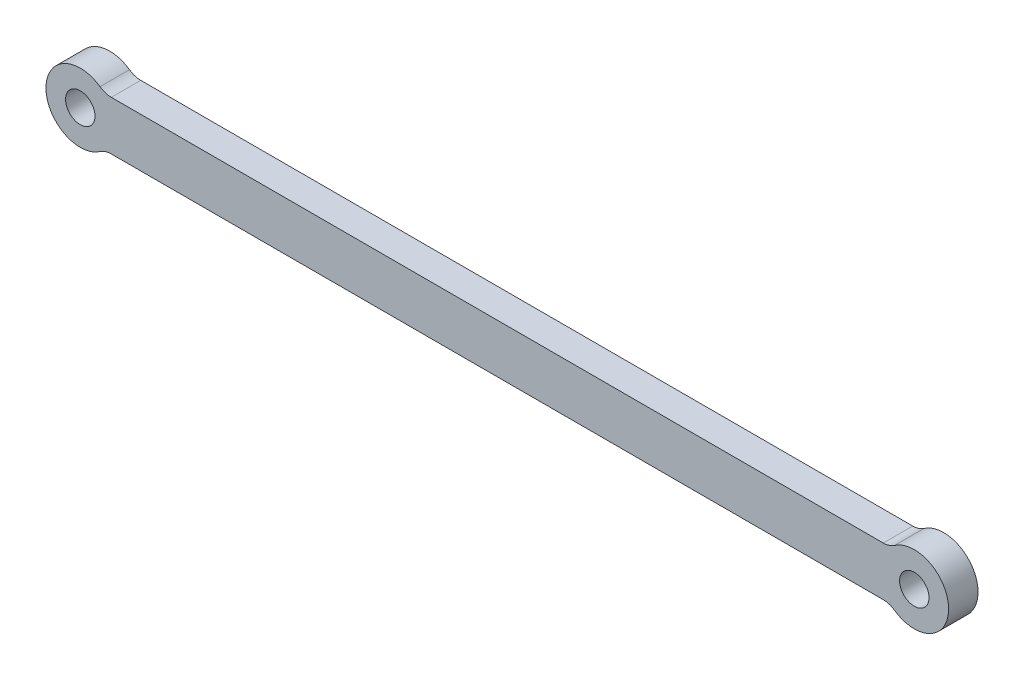
ISO-10303-21;
HEADER;
FILE_DESCRIPTION(('STEP AP214'),'2;1');
FILE_NAME('part.step','',(''),(''),'','','');
FILE_SCHEMA(('AUTOMOTIVE_DESIGN { 1 0 10303 214 1 1 1 1 }'));
ENDSEC;
DATA;
#1=APPLICATION_CONTEXT('core data for automotive mechanical design processes');
#2=APPLICATION_PROTOCOL_DEFINITION('international standard','automotive_design',2000,#1);
#3=PRODUCT_CONTEXT('',#1,'mechanical');
#4=PRODUCT('Part','Part','',(#3));
#5=PRODUCT_RELATED_PRODUCT_CATEGORY('part','',(#4));
#6=PRODUCT_DEFINITION_FORMATION('','',#4);
#7=PRODUCT_DEFINITION_CONTEXT('part definition',#1,'design');
#8=PRODUCT_DEFINITION('design','',#6,#7);
#9=PRODUCT_DEFINITION_SHAPE('','',#8);
#10=(LENGTH_UNIT() NAMED_UNIT(*) SI_UNIT(.MILLI.,.METRE.));
#11=(NAMED_UNIT(*) PLANE_ANGLE_UNIT() SI_UNIT($,.RADIAN.));
#12=(NAMED_UNIT(*) SI_UNIT($,.STERADIAN.) SOLID_ANGLE_UNIT());
#13=UNCERTAINTY_MEASURE_WITH_UNIT(LENGTH_MEASURE(1.E-05),#10,'distance_accuracy_value','');
#14=(GEOMETRIC_REPRESENTATION_CONTEXT(3) GLOBAL_UNCERTAINTY_ASSIGNED_CONTEXT((#13)) GLOBAL_UNIT_ASSIGNED_CONTEXT((#10,
#11,#12)) REPRESENTATION_CONTEXT('',''));
#15=CARTESIAN_POINT('',(0.,0.,0.));
#16=DIRECTION('',(0.,0.,1.));
#17=DIRECTION('',(1.,0.,0.));
#18=AXIS2_PLACEMENT_3D('',#15,#16,#17);
#19=CARTESIAN_POINT('',(0.,0.,3.));
#20=DIRECTION('',(0.,0.,1.));
#21=DIRECTION('',(1.,0.,0.));
#22=AXIS2_PLACEMENT_3D('',#19,#20,#21);
#23=PLANE('',#22);
#24=CARTESIAN_POINT('',(81.8377223398316,-4.49999999999999,3.));
#25=DIRECTION('',(0.,0.,1.));
#26=DIRECTION('',(-1.,0.,0.));
#27=AXIS2_PLACEMENT_3D('',#24,#25,#26);
#28=CIRCLE('',#27,2.);
#29=CARTESIAN_POINT('',(82.9876414889837,-2.86363636363635,3.));
#30=VERTEX_POINT('',#29);
#31=CARTESIAN_POINT('',(81.8377223398316,-2.49999999999999,3.));
#32=VERTEX_POINT('',#31);
#33=EDGE_CURVE('E104',#30,#32,#28,.T.);
#34=ORIENTED_EDGE('',*,*,#33,.F.);
#35=CARTESIAN_POINT('',(85.,0.,3.));
#36=DIRECTION('',(0.,0.,1.));
#37=DIRECTION('',(1.,0.,0.));
#38=AXIS2_PLACEMENT_3D('',#35,#36,#37);
#39=CIRCLE('',#38,3.5);
#40=CARTESIAN_POINT('',(82.9876414889837,2.86363636363636,3.));
#41=VERTEX_POINT('',#40);
#42=EDGE_CURVE('E11',#30,#41,#39,.T.);
#43=ORIENTED_EDGE('',*,*,#42,.T.);
#44=CARTESIAN_POINT('',(81.8377223398316,4.49999999999999,3.));
#45=DIRECTION('',(0.,0.,1.));
#46=DIRECTION('',(1.,0.,0.));
#47=AXIS2_PLACEMENT_3D('',#44,#45,#46);
#48=CIRCLE('',#47,1.99999999999998);
#49=CARTESIAN_POINT('',(81.8377223398316,2.50000000000001,3.));
#50=VERTEX_POINT('',#49);
#51=EDGE_CURVE('E101',#50,#41,#48,.T.);
#52=ORIENTED_EDGE('',*,*,#51,.F.);
#53=DIRECTION('',(1.,0.,0.));
#54=VECTOR('',#53,1.);
#55=CARTESIAN_POINT('',(3.1622776601684,2.5,3.));
#56=LINE('',#55,#54);
#57=CARTESIAN_POINT('',(3.1622776601684,2.5,3.));
#58=VERTEX_POINT('',#57);
#59=EDGE_CURVE('E113',#58,#50,#56,.T.);
#60=ORIENTED_EDGE('',*,*,#59,.F.);
#61=CARTESIAN_POINT('',(3.1622776601684,4.49999999999998,3.));
#62=DIRECTION('',(0.,0.,1.));
#63=DIRECTION('',(-1.,0.,0.));
#64=AXIS2_PLACEMENT_3D('',#61,#62,#63);
#65=CIRCLE('',#64,1.99999999999998);
#66=CARTESIAN_POINT('',(2.01235851101626,2.86363636363637,3.));
#67=VERTEX_POINT('',#66);
#68=EDGE_CURVE('E118',#67,#58,#65,.T.);
#69=ORIENTED_EDGE('',*,*,#68,.F.);
#70=CARTESIAN_POINT('',(0.,0.,3.));
#71=DIRECTION('',(0.,0.,1.));
#72=DIRECTION('',(1.,0.,0.));
#73=AXIS2_PLACEMENT_3D('',#70,#71,#72);
#74=CIRCLE('',#73,3.5);
#75=CARTESIAN_POINT('',(2.01235851101626,-2.86363636363637,3.));
#76=VERTEX_POINT('',#75);
#77=EDGE_CURVE('E44',#67,#76,#74,.T.);
#78=ORIENTED_EDGE('',*,*,#77,.T.);
#79=CARTESIAN_POINT('',(3.1622776601684,-4.5,3.));
#80=DIRECTION('',(0.,0.,1.));
#81=DIRECTION('',(1.,0.,0.));
#82=AXIS2_PLACEMENT_3D('',#79,#80,#81);
#83=CIRCLE('',#82,2.);
#84=CARTESIAN_POINT('',(3.1622776601684,-2.5,3.));
#85=VERTEX_POINT('',#84);
#86=EDGE_CURVE('E157',#85,#76,#83,.T.);
#87=ORIENTED_EDGE('',*,*,#86,.F.);
#88=DIRECTION('',(-1.,0.,0.));
#89=VECTOR('',#88,1.);
#90=CARTESIAN_POINT('',(3.1622776601684,-2.5,3.));
#91=LINE('',#90,#89);
#92=EDGE_CURVE('E172',#32,#85,#91,.T.);
#93=ORIENTED_EDGE('',*,*,#92,.F.);
#94=EDGE_LOOP('',(#34,#43,#52,#60,#69,#78,#87,#93));
#95=FACE_BOUND('',#94,.T.);
#96=CARTESIAN_POINT('',(0.,0.,3.));
#97=DIRECTION('',(0.,0.,1.));
#98=DIRECTION('',(1.,0.,0.));
#99=AXIS2_PLACEMENT_3D('',#96,#97,#98);
#100=CIRCLE('',#99,1.5);
#101=CARTESIAN_POINT('',(1.5,0.,3.));
#102=VERTEX_POINT('',#101);
#103=EDGE_CURVE('E137',#102,#102,#100,.T.);
#104=ORIENTED_EDGE('',*,*,#103,.F.);
#105=EDGE_LOOP('',(#104));
#106=FACE_BOUND('',#105,.T.);
#107=CARTESIAN_POINT('',(85.,0.,3.));
#108=DIRECTION('',(0.,0.,1.));
#109=DIRECTION('',(1.,0.,0.));
#110=AXIS2_PLACEMENT_3D('',#107,#108,#109);
#111=CIRCLE('',#110,1.5);
#112=CARTESIAN_POINT('',(86.5,0.,3.));
#113=VERTEX_POINT('',#112);
#114=EDGE_CURVE('E129',#113,#113,#111,.T.);
#115=ORIENTED_EDGE('',*,*,#114,.F.);
#116=EDGE_LOOP('',(#115));
#117=FACE_BOUND('',#116,.T.);
#118=ADVANCED_FACE('F34',(#95,#106,#117),#23,.T.);
#119=CARTESIAN_POINT('',(0.,0.,0.));
#120=DIRECTION('',(0.,0.,1.));
#121=DIRECTION('',(1.,0.,0.));
#122=AXIS2_PLACEMENT_3D('',#119,#120,#121);
#123=PLANE('',#122);
#124=CARTESIAN_POINT('',(85.,0.,0.));
#125=DIRECTION('',(0.,0.,1.));
#126=DIRECTION('',(1.,0.,0.));
#127=AXIS2_PLACEMENT_3D('',#124,#125,#126);
#128=CIRCLE('',#127,3.5);
#129=CARTESIAN_POINT('',(82.9876414889837,-2.86363636363635,0.));
#130=VERTEX_POINT('',#129);
#131=CARTESIAN_POINT('',(82.9876414889837,2.86363636363636,0.));
#132=VERTEX_POINT('',#131);
#133=EDGE_CURVE('E38',#130,#132,#128,.T.);
#134=ORIENTED_EDGE('',*,*,#133,.F.);
#135=CARTESIAN_POINT('',(81.8377223398316,-4.49999999999999,0.));
#136=DIRECTION('',(0.,0.,1.));
#137=DIRECTION('',(-1.,0.,0.));
#138=AXIS2_PLACEMENT_3D('',#135,#136,#137);
#139=CIRCLE('',#138,2.);
#140=CARTESIAN_POINT('',(81.8377223398316,-2.49999999999999,0.));
#141=VERTEX_POINT('',#140);
#142=EDGE_CURVE('E167',#130,#141,#139,.T.);
#143=ORIENTED_EDGE('',*,*,#142,.T.);
#144=DIRECTION('',(-1.,0.,0.));
#145=VECTOR('',#144,1.);
#146=CARTESIAN_POINT('',(3.1622776601684,-2.5,0.));
#147=LINE('',#146,#145);
#148=CARTESIAN_POINT('',(3.1622776601684,-2.5,0.));
#149=VERTEX_POINT('',#148);
#150=EDGE_CURVE('E163',#141,#149,#147,.T.);
#151=ORIENTED_EDGE('',*,*,#150,.T.);
#152=CARTESIAN_POINT('',(3.1622776601684,-4.5,0.));
#153=DIRECTION('',(0.,0.,1.));
#154=DIRECTION('',(1.,0.,0.));
#155=AXIS2_PLACEMENT_3D('',#152,#153,#154);
#156=CIRCLE('',#155,2.);
#157=CARTESIAN_POINT('',(2.01235851101626,-2.86363636363637,0.));
#158=VERTEX_POINT('',#157);
#159=EDGE_CURVE('E154',#149,#158,#156,.T.);
#160=ORIENTED_EDGE('',*,*,#159,.T.);
#161=CARTESIAN_POINT('',(0.,0.,0.));
#162=DIRECTION('',(0.,0.,1.));
#163=DIRECTION('',(1.,0.,0.));
#164=AXIS2_PLACEMENT_3D('',#161,#162,#163);
#165=CIRCLE('',#164,3.5);
#166=CARTESIAN_POINT('',(2.01235851101626,2.86363636363637,0.));
#167=VERTEX_POINT('',#166);
#168=EDGE_CURVE('E140',#167,#158,#165,.T.);
#169=ORIENTED_EDGE('',*,*,#168,.F.);
#170=CARTESIAN_POINT('',(3.1622776601684,4.49999999999998,0.));
#171=DIRECTION('',(0.,0.,1.));
#172=DIRECTION('',(-1.,0.,0.));
#173=AXIS2_PLACEMENT_3D('',#170,#171,#172);
#174=CIRCLE('',#173,1.99999999999998);
#175=CARTESIAN_POINT('',(3.1622776601684,2.5,0.));
#176=VERTEX_POINT('',#175);
#177=EDGE_CURVE('E112',#167,#176,#174,.T.);
#178=ORIENTED_EDGE('',*,*,#177,.T.);
#179=DIRECTION('',(1.,0.,0.));
#180=VECTOR('',#179,1.);
#181=CARTESIAN_POINT('',(3.1622776601684,2.5,0.));
#182=LINE('',#181,#180);
#183=CARTESIAN_POINT('',(81.8377223398316,2.50000000000001,0.));
#184=VERTEX_POINT('',#183);
#185=EDGE_CURVE('E116',#176,#184,#182,.T.);
#186=ORIENTED_EDGE('',*,*,#185,.T.);
#187=CARTESIAN_POINT('',(81.8377223398316,4.49999999999999,0.));
#188=DIRECTION('',(0.,0.,1.));
#189=DIRECTION('',(1.,0.,0.));
#190=AXIS2_PLACEMENT_3D('',#187,#188,#189);
#191=CIRCLE('',#190,1.99999999999998);
#192=EDGE_CURVE('E128',#184,#132,#191,.T.);
#193=ORIENTED_EDGE('',*,*,#192,.T.);
#194=EDGE_LOOP('',(#134,#143,#151,#160,#169,#178,#186,#193));
#195=FACE_BOUND('',#194,.T.);
#196=CARTESIAN_POINT('',(0.,0.,0.));
#197=DIRECTION('',(0.,0.,1.));
#198=DIRECTION('',(1.,0.,0.));
#199=AXIS2_PLACEMENT_3D('',#196,#197,#198);
#200=CIRCLE('',#199,1.5);
#201=CARTESIAN_POINT('',(1.5,0.,0.));
#202=VERTEX_POINT('',#201);
#203=EDGE_CURVE('E132',#202,#202,#200,.T.);
#204=ORIENTED_EDGE('',*,*,#203,.T.);
#205=EDGE_LOOP('',(#204));
#206=FACE_BOUND('',#205,.T.);
#207=CARTESIAN_POINT('',(85.,0.,0.));
#208=DIRECTION('',(0.,0.,1.));
#209=DIRECTION('',(1.,0.,0.));
#210=AXIS2_PLACEMENT_3D('',#207,#208,#209);
#211=CIRCLE('',#210,1.5);
#212=CARTESIAN_POINT('',(86.5,0.,0.));
#213=VERTEX_POINT('',#212);
#214=EDGE_CURVE('E133',#213,#213,#211,.T.);
#215=ORIENTED_EDGE('',*,*,#214,.T.);
#216=EDGE_LOOP('',(#215));
#217=FACE_BOUND('',#216,.T.);
#218=ADVANCED_FACE('F160',(#195,#206,#217),#123,.F.);
#219=CARTESIAN_POINT('',(0.,0.,3.));
#220=DIRECTION('',(0.,0.,-1.));
#221=DIRECTION('',(-1.,0.,0.));
#222=AXIS2_PLACEMENT_3D('',#219,#220,#221);
#223=CYLINDRICAL_SURFACE('',#222,3.5);
#224=ORIENTED_EDGE('',*,*,#168,.T.);
#225=DIRECTION('',(0.,0.,1.));
#226=VECTOR('',#225,1.);
#227=CARTESIAN_POINT('',(2.01235851101626,-2.86363636363637,0.));
#228=LINE('',#227,#226);
#229=EDGE_CURVE('E147',#158,#76,#228,.T.);
#230=ORIENTED_EDGE('',*,*,#229,.T.);
#231=ORIENTED_EDGE('',*,*,#77,.F.);
#232=DIRECTION('',(0.,0.,1.));
#233=VECTOR('',#232,1.);
#234=CARTESIAN_POINT('',(2.01235851101626,2.86363636363637,0.));
#235=LINE('',#234,#233);
#236=EDGE_CURVE('E125',#167,#67,#235,.T.);
#237=ORIENTED_EDGE('',*,*,#236,.F.);
#238=EDGE_LOOP('',(#224,#230,#231,#237));
#239=FACE_BOUND('',#238,.T.);
#240=ADVANCED_FACE('F36',(#239),#223,.T.);
#241=CARTESIAN_POINT('',(85.,0.,3.));
#242=DIRECTION('',(0.,0.,-1.));
#243=DIRECTION('',(-1.,0.,0.));
#244=AXIS2_PLACEMENT_3D('',#241,#242,#243);
#245=CYLINDRICAL_SURFACE('',#244,3.5);
#246=ORIENTED_EDGE('',*,*,#133,.T.);
#247=DIRECTION('',(0.,0.,1.));
#248=VECTOR('',#247,1.);
#249=CARTESIAN_POINT('',(82.9876414889837,2.86363636363636,0.));
#250=LINE('',#249,#248);
#251=EDGE_CURVE('E108',#132,#41,#250,.T.);
#252=ORIENTED_EDGE('',*,*,#251,.T.);
#253=ORIENTED_EDGE('',*,*,#42,.F.);
#254=DIRECTION('',(0.,0.,1.));
#255=VECTOR('',#254,1.);
#256=CARTESIAN_POINT('',(82.9876414889837,-2.86363636363635,0.));
#257=LINE('',#256,#255);
#258=EDGE_CURVE('E136',#130,#30,#257,.T.);
#259=ORIENTED_EDGE('',*,*,#258,.F.);
#260=EDGE_LOOP('',(#246,#252,#253,#259));
#261=FACE_BOUND('',#260,.T.);
#262=ADVANCED_FACE('F109',(#261),#245,.T.);
#263=CARTESIAN_POINT('',(0.,0.,3.));
#264=DIRECTION('',(0.,0.,-1.));
#265=DIRECTION('',(-1.,0.,0.));
#266=AXIS2_PLACEMENT_3D('',#263,#264,#265);
#267=CYLINDRICAL_SURFACE('',#266,1.5);
#268=ORIENTED_EDGE('',*,*,#103,.T.);
#269=EDGE_LOOP('',(#268));
#270=FACE_BOUND('',#269,.T.);
#271=ORIENTED_EDGE('',*,*,#203,.F.);
#272=EDGE_LOOP('',(#271));
#273=FACE_BOUND('',#272,.T.);
#274=ADVANCED_FACE('F204',(#270,#273),#267,.F.);
#275=CARTESIAN_POINT('',(85.,0.,3.));
#276=DIRECTION('',(0.,0.,-1.));
#277=DIRECTION('',(-1.,0.,0.));
#278=AXIS2_PLACEMENT_3D('',#275,#276,#277);
#279=CYLINDRICAL_SURFACE('',#278,1.5);
#280=ORIENTED_EDGE('',*,*,#114,.T.);
#281=EDGE_LOOP('',(#280));
#282=FACE_BOUND('',#281,.T.);
#283=ORIENTED_EDGE('',*,*,#214,.F.);
#284=EDGE_LOOP('',(#283));
#285=FACE_BOUND('',#284,.T.);
#286=ADVANCED_FACE('F195',(#282,#285),#279,.F.);
#287=CARTESIAN_POINT('',(81.8377223398316,4.49999999999999,0.));
#288=DIRECTION('',(0.,0.,1.));
#289=DIRECTION('',(1.,0.,0.));
#290=AXIS2_PLACEMENT_3D('',#287,#288,#289);
#291=CYLINDRICAL_SURFACE('',#290,1.99999999999998);
#292=ORIENTED_EDGE('',*,*,#51,.T.);
#293=ORIENTED_EDGE('',*,*,#251,.F.);
#294=ORIENTED_EDGE('',*,*,#192,.F.);
#295=DIRECTION('',(0.,0.,1.));
#296=VECTOR('',#295,1.);
#297=CARTESIAN_POINT('',(81.8377223398316,2.50000000000001,0.));
#298=LINE('',#297,#296);
#299=EDGE_CURVE('E93',#184,#50,#298,.T.);
#300=ORIENTED_EDGE('',*,*,#299,.T.);
#301=EDGE_LOOP('',(#292,#293,#294,#300));
#302=FACE_BOUND('',#301,.T.);
#303=ADVANCED_FACE('F111',(#302),#291,.F.);
#304=CARTESIAN_POINT('',(3.1622776601684,2.5,0.));
#305=DIRECTION('',(0.,-1.,0.));
#306=DIRECTION('',(1.,0.,0.));
#307=AXIS2_PLACEMENT_3D('',#304,#305,#306);
#308=PLANE('',#307);
#309=ORIENTED_EDGE('',*,*,#59,.T.);
#310=ORIENTED_EDGE('',*,*,#299,.F.);
#311=ORIENTED_EDGE('',*,*,#185,.F.);
#312=DIRECTION('',(0.,0.,1.));
#313=VECTOR('',#312,1.);
#314=CARTESIAN_POINT('',(3.1622776601684,2.5,0.));
#315=LINE('',#314,#313);
#316=EDGE_CURVE('E123',#176,#58,#315,.T.);
#317=ORIENTED_EDGE('',*,*,#316,.T.);
#318=EDGE_LOOP('',(#309,#310,#311,#317));
#319=FACE_BOUND('',#318,.T.);
#320=ADVANCED_FACE('F186',(#319),#308,.F.);
#321=CARTESIAN_POINT('',(3.1622776601684,4.49999999999998,0.));
#322=DIRECTION('',(0.,0.,1.));
#323=DIRECTION('',(1.,0.,0.));
#324=AXIS2_PLACEMENT_3D('',#321,#322,#323);
#325=CYLINDRICAL_SURFACE('',#324,1.99999999999998);
#326=ORIENTED_EDGE('',*,*,#68,.T.);
#327=ORIENTED_EDGE('',*,*,#316,.F.);
#328=ORIENTED_EDGE('',*,*,#177,.F.);
#329=ORIENTED_EDGE('',*,*,#236,.T.);
#330=EDGE_LOOP('',(#326,#327,#328,#329));
#331=FACE_BOUND('',#330,.T.);
#332=ADVANCED_FACE('F183',(#331),#325,.F.);
#333=CARTESIAN_POINT('',(81.8377223398316,-4.49999999999999,0.));
#334=DIRECTION('',(0.,0.,1.));
#335=DIRECTION('',(1.,0.,0.));
#336=AXIS2_PLACEMENT_3D('',#333,#334,#335);
#337=CYLINDRICAL_SURFACE('',#336,2.);
#338=ORIENTED_EDGE('',*,*,#33,.T.);
#339=DIRECTION('',(0.,0.,1.));
#340=VECTOR('',#339,1.);
#341=CARTESIAN_POINT('',(81.8377223398316,-2.49999999999999,0.));
#342=LINE('',#341,#340);
#343=EDGE_CURVE('E164',#141,#32,#342,.T.);
#344=ORIENTED_EDGE('',*,*,#343,.F.);
#345=ORIENTED_EDGE('',*,*,#142,.F.);
#346=ORIENTED_EDGE('',*,*,#258,.T.);
#347=EDGE_LOOP('',(#338,#344,#345,#346));
#348=FACE_BOUND('',#347,.T.);
#349=ADVANCED_FACE('F193',(#348),#337,.F.);
#350=CARTESIAN_POINT('',(3.1622776601684,-4.5,0.));
#351=DIRECTION('',(0.,0.,1.));
#352=DIRECTION('',(1.,0.,0.));
#353=AXIS2_PLACEMENT_3D('',#350,#351,#352);
#354=CYLINDRICAL_SURFACE('',#353,2.);
#355=ORIENTED_EDGE('',*,*,#86,.T.);
#356=ORIENTED_EDGE('',*,*,#229,.F.);
#357=ORIENTED_EDGE('',*,*,#159,.F.);
#358=DIRECTION('',(0.,0.,1.));
#359=VECTOR('',#358,1.);
#360=CARTESIAN_POINT('',(3.1622776601684,-2.5,0.));
#361=LINE('',#360,#359);
#362=EDGE_CURVE('E158',#149,#85,#361,.T.);
#363=ORIENTED_EDGE('',*,*,#362,.T.);
#364=EDGE_LOOP('',(#355,#356,#357,#363));
#365=FACE_BOUND('',#364,.T.);
#366=ADVANCED_FACE('F153',(#365),#354,.F.);
#367=CARTESIAN_POINT('',(3.1622776601684,-2.5,0.));
#368=DIRECTION('',(0.,1.,0.));
#369=DIRECTION('',(-1.,0.,0.));
#370=AXIS2_PLACEMENT_3D('',#367,#368,#369);
#371=PLANE('',#370);
#372=ORIENTED_EDGE('',*,*,#92,.T.);
#373=ORIENTED_EDGE('',*,*,#362,.F.);
#374=ORIENTED_EDGE('',*,*,#150,.F.);
#375=ORIENTED_EDGE('',*,*,#343,.T.);
#376=EDGE_LOOP('',(#372,#373,#374,#375));
#377=FACE_BOUND('',#376,.T.);
#378=ADVANCED_FACE('F286',(#377),#371,.F.);
#379=CLOSED_SHELL('',(#118,#218,#240,#262,#274,#286,#303,#320,#332,#349,#366,#378));
#380=MANIFOLD_SOLID_BREP('B2',#379);
#381=ADVANCED_BREP_SHAPE_REPRESENTATION('',(#18,#380),#14);
#382=SHAPE_DEFINITION_REPRESENTATION(#9,#381);
ENDSEC;
END-ISO-10303-21;
